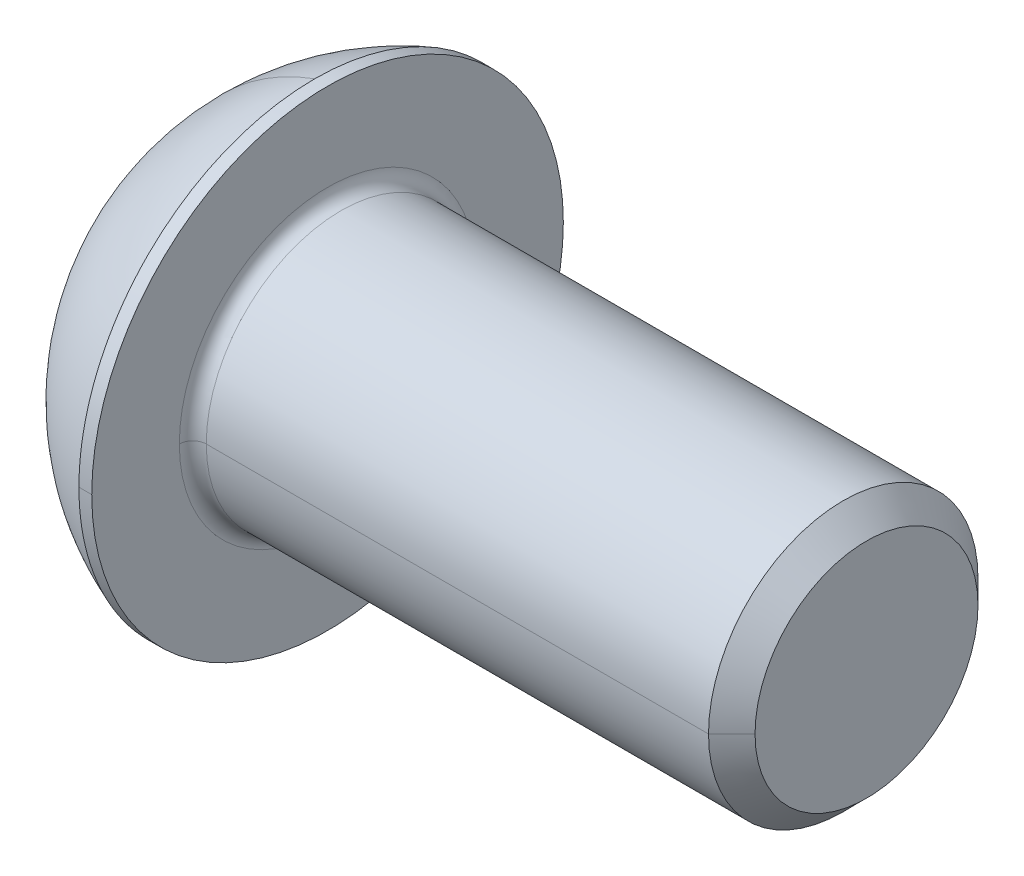
ISO-10303-21;
HEADER;
FILE_DESCRIPTION(('STEP AP214'),'2;1');
FILE_NAME('part.step','',(''),(''),'','','');
FILE_SCHEMA(('AUTOMOTIVE_DESIGN { 1 0 10303 214 1 1 1 1 }'));
ENDSEC;
DATA;
#1=APPLICATION_CONTEXT('core data for automotive mechanical design processes');
#2=APPLICATION_PROTOCOL_DEFINITION('international standard','automotive_design',2000,#1);
#3=PRODUCT_CONTEXT('',#1,'mechanical');
#4=PRODUCT('Part','Part','',(#3));
#5=PRODUCT_RELATED_PRODUCT_CATEGORY('part','',(#4));
#6=PRODUCT_DEFINITION_FORMATION('','',#4);
#7=PRODUCT_DEFINITION_CONTEXT('part definition',#1,'design');
#8=PRODUCT_DEFINITION('design','',#6,#7);
#9=PRODUCT_DEFINITION_SHAPE('','',#8);
#10=(LENGTH_UNIT() NAMED_UNIT(*) SI_UNIT(.MILLI.,.METRE.));
#11=(NAMED_UNIT(*) PLANE_ANGLE_UNIT() SI_UNIT($,.RADIAN.));
#12=(NAMED_UNIT(*) SI_UNIT($,.STERADIAN.) SOLID_ANGLE_UNIT());
#13=UNCERTAINTY_MEASURE_WITH_UNIT(LENGTH_MEASURE(1.E-05),#10,'distance_accuracy_value','');
#14=(GEOMETRIC_REPRESENTATION_CONTEXT(3) GLOBAL_UNCERTAINTY_ASSIGNED_CONTEXT((#13)) GLOBAL_UNIT_ASSIGNED_CONTEXT((#10,
#11,#12)) REPRESENTATION_CONTEXT('',''));
#15=CARTESIAN_POINT('',(0.,0.,0.));
#16=DIRECTION('',(0.,0.,1.));
#17=DIRECTION('',(1.,0.,0.));
#18=AXIS2_PLACEMENT_3D('',#15,#16,#17);
#19=CARTESIAN_POINT('',(-995.956624327026,0.,0.));
#20=DIRECTION('',(-1.,0.,0.));
#21=DIRECTION('',(0.,0.,1.));
#22=AXIS2_PLACEMENT_3D('',#19,#20,#21);
#23=CONICAL_SURFACE('',#22,1732.05080756885,1.0471975511966);
#24=DIRECTION('',(-0.5,0.,-0.866025403784436));
#25=VECTOR('',#24,1.);
#26=CARTESIAN_POINT('',(4.04337567297408,0.,0.));
#27=LINE('',#26,#25);
#28=CARTESIAN_POINT('',(4.04337567297408,0.,0.));
#29=VERTEX_POINT('',#28);
#30=CARTESIAN_POINT('',(2.6,0.,-2.5));
#31=VERTEX_POINT('',#30);
#32=EDGE_CURVE('E227',#29,#31,#27,.T.);
#33=ORIENTED_EDGE('',*,*,#32,.F.);
#34=DIRECTION('',(-0.5,0.,0.866025403784436));
#35=VECTOR('',#34,1.);
#36=CARTESIAN_POINT('',(4.04337567297408,0.,0.));
#37=LINE('',#36,#35);
#38=CARTESIAN_POINT('',(2.6,0.,2.5));
#39=VERTEX_POINT('',#38);
#40=EDGE_CURVE('E232',#29,#39,#37,.T.);
#41=ORIENTED_EDGE('',*,*,#40,.T.);
#42=CARTESIAN_POINT('',(2.6,0.,0.));
#43=DIRECTION('',(-1.,0.,0.));
#44=DIRECTION('',(0.,0.,1.));
#45=AXIS2_PLACEMENT_3D('',#42,#43,#44);
#46=CIRCLE('',#45,2.5);
#47=CARTESIAN_POINT('',(2.6,2.1650635094611,1.25));
#48=VERTEX_POINT('',#47);
#49=EDGE_CURVE('E11',#39,#48,#46,.T.);
#50=ORIENTED_EDGE('',*,*,#49,.T.);
#51=CARTESIAN_POINT('',(2.6,0.,0.));
#52=DIRECTION('',(-1.,0.,0.));
#53=DIRECTION('',(0.,0.,1.));
#54=AXIS2_PLACEMENT_3D('',#51,#52,#53);
#55=CIRCLE('',#54,2.5);
#56=CARTESIAN_POINT('',(2.6,2.1650635094611,-1.25));
#57=VERTEX_POINT('',#56);
#58=EDGE_CURVE('E27',#48,#57,#55,.T.);
#59=ORIENTED_EDGE('',*,*,#58,.T.);
#60=CARTESIAN_POINT('',(2.6,0.,0.));
#61=DIRECTION('',(-1.,0.,0.));
#62=DIRECTION('',(0.,0.,1.));
#63=AXIS2_PLACEMENT_3D('',#60,#61,#62);
#64=CIRCLE('',#63,2.5);
#65=EDGE_CURVE('E259',#57,#31,#64,.T.);
#66=ORIENTED_EDGE('',*,*,#65,.T.);
#67=EDGE_LOOP('',(#33,#41,#50,#59,#66));
#68=FACE_BOUND('',#67,.T.);
#69=ADVANCED_FACE('F16',(#68),#23,.F.);
#70=CARTESIAN_POINT('',(2.6,-2.88675134594813,0.));
#71=DIRECTION('',(1.,0.,0.));
#72=DIRECTION('',(0.,1.,0.));
#73=AXIS2_PLACEMENT_3D('',#70,#71,#72);
#74=PLANE('',#73);
#75=CARTESIAN_POINT('',(2.6,0.,0.));
#76=DIRECTION('',(-1.,0.,0.));
#77=DIRECTION('',(0.,0.,1.));
#78=AXIS2_PLACEMENT_3D('',#75,#76,#77);
#79=CIRCLE('',#78,2.5);
#80=CARTESIAN_POINT('',(2.6,-2.1650635094611,-1.25));
#81=VERTEX_POINT('',#80);
#82=EDGE_CURVE('E231',#31,#81,#79,.T.);
#83=ORIENTED_EDGE('',*,*,#82,.F.);
#84=DIRECTION('',(0.,1.,0.));
#85=VECTOR('',#84,1.);
#86=CARTESIAN_POINT('',(2.6,1.44337567297406,-2.5));
#87=LINE('',#86,#85);
#88=CARTESIAN_POINT('',(2.6,-1.44337567297406,-2.5));
#89=VERTEX_POINT('',#88);
#90=EDGE_CURVE('E381',#89,#31,#87,.T.);
#91=ORIENTED_EDGE('',*,*,#90,.F.);
#92=DIRECTION('',(0.,0.5,-0.866025403784439));
#93=VECTOR('',#92,1.);
#94=CARTESIAN_POINT('',(2.6,-1.44337567297406,-2.5));
#95=LINE('',#94,#93);
#96=EDGE_CURVE('E353',#81,#89,#95,.T.);
#97=ORIENTED_EDGE('',*,*,#96,.F.);
#98=EDGE_LOOP('',(#83,#91,#97));
#99=FACE_BOUND('',#98,.T.);
#100=ADVANCED_FACE('F462',(#99),#74,.F.);
#101=CARTESIAN_POINT('',(2.6,-2.88675134594813,0.));
#102=DIRECTION('',(1.,0.,0.));
#103=DIRECTION('',(0.,1.,0.));
#104=AXIS2_PLACEMENT_3D('',#101,#102,#103);
#105=PLANE('',#104);
#106=CARTESIAN_POINT('',(2.6,0.,0.));
#107=DIRECTION('',(-1.,0.,0.));
#108=DIRECTION('',(0.,0.,1.));
#109=AXIS2_PLACEMENT_3D('',#106,#107,#108);
#110=CIRCLE('',#109,2.5);
#111=CARTESIAN_POINT('',(2.6,-2.1650635094611,1.25));
#112=VERTEX_POINT('',#111);
#113=EDGE_CURVE('E239',#81,#112,#110,.T.);
#114=ORIENTED_EDGE('',*,*,#113,.F.);
#115=DIRECTION('',(0.,0.5,-0.866025403784439));
#116=VECTOR('',#115,1.);
#117=CARTESIAN_POINT('',(2.6,-1.44337567297406,-2.5));
#118=LINE('',#117,#116);
#119=CARTESIAN_POINT('',(2.6,-2.88675134594813,0.));
#120=VERTEX_POINT('',#119);
#121=EDGE_CURVE('E281',#120,#81,#118,.T.);
#122=ORIENTED_EDGE('',*,*,#121,.F.);
#123=DIRECTION('',(0.,-0.5,-0.866025403784439));
#124=VECTOR('',#123,1.);
#125=CARTESIAN_POINT('',(2.6,-2.88675134594813,0.));
#126=LINE('',#125,#124);
#127=EDGE_CURVE('E286',#112,#120,#126,.T.);
#128=ORIENTED_EDGE('',*,*,#127,.F.);
#129=EDGE_LOOP('',(#114,#122,#128));
#130=FACE_BOUND('',#129,.T.);
#131=ADVANCED_FACE('F468',(#130),#105,.F.);
#132=CARTESIAN_POINT('',(2.6,-2.88675134594813,0.));
#133=DIRECTION('',(1.,0.,0.));
#134=DIRECTION('',(0.,1.,0.));
#135=AXIS2_PLACEMENT_3D('',#132,#133,#134);
#136=PLANE('',#135);
#137=CARTESIAN_POINT('',(2.6,0.,0.));
#138=DIRECTION('',(-1.,0.,0.));
#139=DIRECTION('',(0.,0.,1.));
#140=AXIS2_PLACEMENT_3D('',#137,#138,#139);
#141=CIRCLE('',#140,2.5);
#142=EDGE_CURVE('E240',#112,#39,#141,.T.);
#143=ORIENTED_EDGE('',*,*,#142,.F.);
#144=DIRECTION('',(0.,-0.5,-0.866025403784439));
#145=VECTOR('',#144,1.);
#146=CARTESIAN_POINT('',(2.6,-2.88675134594813,0.));
#147=LINE('',#146,#145);
#148=CARTESIAN_POINT('',(2.6,-1.44337567297406,2.5));
#149=VERTEX_POINT('',#148);
#150=EDGE_CURVE('E202',#149,#112,#147,.T.);
#151=ORIENTED_EDGE('',*,*,#150,.F.);
#152=DIRECTION('',(0.,-1.,0.));
#153=VECTOR('',#152,1.);
#154=CARTESIAN_POINT('',(2.6,-1.44337567297406,2.5));
#155=LINE('',#154,#153);
#156=EDGE_CURVE('E276',#39,#149,#155,.T.);
#157=ORIENTED_EDGE('',*,*,#156,.F.);
#158=EDGE_LOOP('',(#143,#151,#157));
#159=FACE_BOUND('',#158,.T.);
#160=ADVANCED_FACE('F485',(#159),#136,.F.);
#161=CARTESIAN_POINT('',(2.6,-2.88675134594813,0.));
#162=DIRECTION('',(1.,0.,0.));
#163=DIRECTION('',(0.,1.,0.));
#164=AXIS2_PLACEMENT_3D('',#161,#162,#163);
#165=PLANE('',#164);
#166=ORIENTED_EDGE('',*,*,#49,.F.);
#167=DIRECTION('',(0.,-1.,0.));
#168=VECTOR('',#167,1.);
#169=CARTESIAN_POINT('',(2.6,-1.44337567297406,2.5));
#170=LINE('',#169,#168);
#171=CARTESIAN_POINT('',(2.6,1.44337567297406,2.5));
#172=VERTEX_POINT('',#171);
#173=EDGE_CURVE('E42',#172,#39,#170,.T.);
#174=ORIENTED_EDGE('',*,*,#173,.F.);
#175=DIRECTION('',(0.,-0.5,0.866025403784439));
#176=VECTOR('',#175,1.);
#177=CARTESIAN_POINT('',(2.6,1.44337567297406,2.5));
#178=LINE('',#177,#176);
#179=EDGE_CURVE('E298',#48,#172,#178,.T.);
#180=ORIENTED_EDGE('',*,*,#179,.F.);
#181=EDGE_LOOP('',(#166,#174,#180));
#182=FACE_BOUND('',#181,.T.);
#183=ADVANCED_FACE('F488',(#182),#165,.F.);
#184=CARTESIAN_POINT('',(2.6,-2.88675134594813,0.));
#185=DIRECTION('',(1.,0.,0.));
#186=DIRECTION('',(0.,1.,0.));
#187=AXIS2_PLACEMENT_3D('',#184,#185,#186);
#188=PLANE('',#187);
#189=ORIENTED_EDGE('',*,*,#58,.F.);
#190=DIRECTION('',(0.,-0.5,0.866025403784439));
#191=VECTOR('',#190,1.);
#192=CARTESIAN_POINT('',(2.6,1.44337567297406,2.5));
#193=LINE('',#192,#191);
#194=CARTESIAN_POINT('',(2.6,2.88675134594813,0.));
#195=VERTEX_POINT('',#194);
#196=EDGE_CURVE('E289',#195,#48,#193,.T.);
#197=ORIENTED_EDGE('',*,*,#196,.F.);
#198=DIRECTION('',(0.,0.5,0.866025403784439));
#199=VECTOR('',#198,1.);
#200=CARTESIAN_POINT('',(2.6,2.88675134594813,0.));
#201=LINE('',#200,#199);
#202=EDGE_CURVE('E245',#57,#195,#201,.T.);
#203=ORIENTED_EDGE('',*,*,#202,.F.);
#204=EDGE_LOOP('',(#189,#197,#203));
#205=FACE_BOUND('',#204,.T.);
#206=ADVANCED_FACE('F473',(#205),#188,.F.);
#207=CARTESIAN_POINT('',(2.6,-2.88675134594813,0.));
#208=DIRECTION('',(1.,0.,0.));
#209=DIRECTION('',(0.,1.,0.));
#210=AXIS2_PLACEMENT_3D('',#207,#208,#209);
#211=PLANE('',#210);
#212=ORIENTED_EDGE('',*,*,#65,.F.);
#213=DIRECTION('',(0.,0.5,0.866025403784439));
#214=VECTOR('',#213,1.);
#215=CARTESIAN_POINT('',(2.6,2.88675134594813,0.));
#216=LINE('',#215,#214);
#217=CARTESIAN_POINT('',(2.6,1.44337567297406,-2.5));
#218=VERTEX_POINT('',#217);
#219=EDGE_CURVE('E250',#218,#57,#216,.T.);
#220=ORIENTED_EDGE('',*,*,#219,.F.);
#221=DIRECTION('',(0.,1.,0.));
#222=VECTOR('',#221,1.);
#223=CARTESIAN_POINT('',(2.6,1.44337567297406,-2.5));
#224=LINE('',#223,#222);
#225=EDGE_CURVE('E293',#31,#218,#224,.T.);
#226=ORIENTED_EDGE('',*,*,#225,.F.);
#227=EDGE_LOOP('',(#212,#220,#226));
#228=FACE_BOUND('',#227,.T.);
#229=ADVANCED_FACE('F539',(#228),#211,.F.);
#230=CARTESIAN_POINT('',(2.6,-1.44337567297406,2.5));
#231=DIRECTION('',(0.,0.,-1.));
#232=DIRECTION('',(0.,-1.,0.));
#233=AXIS2_PLACEMENT_3D('',#230,#231,#232);
#234=PLANE('',#233);
#235=ORIENTED_EDGE('',*,*,#173,.T.);
#236=ORIENTED_EDGE('',*,*,#156,.T.);
#237=DIRECTION('',(-1.,0.,0.));
#238=VECTOR('',#237,1.);
#239=CARTESIAN_POINT('',(2.6,-1.44337567297406,2.5));
#240=LINE('',#239,#238);
#241=CARTESIAN_POINT('',(0.,-1.44337567297406,2.5));
#242=VERTEX_POINT('',#241);
#243=EDGE_CURVE('E278',#149,#242,#240,.T.);
#244=ORIENTED_EDGE('',*,*,#243,.T.);
#245=DIRECTION('',(0.,-1.,0.));
#246=VECTOR('',#245,1.);
#247=CARTESIAN_POINT('',(0.,-1.44337567297406,2.5));
#248=LINE('',#247,#246);
#249=CARTESIAN_POINT('',(0.,1.44337567297406,2.5));
#250=VERTEX_POINT('',#249);
#251=EDGE_CURVE('E368',#250,#242,#248,.T.);
#252=ORIENTED_EDGE('',*,*,#251,.F.);
#253=DIRECTION('',(-1.,0.,0.));
#254=VECTOR('',#253,1.);
#255=CARTESIAN_POINT('',(2.6,1.44337567297406,2.5));
#256=LINE('',#255,#254);
#257=EDGE_CURVE('E277',#172,#250,#256,.T.);
#258=ORIENTED_EDGE('',*,*,#257,.F.);
#259=EDGE_LOOP('',(#235,#236,#244,#252,#258));
#260=FACE_BOUND('',#259,.T.);
#261=ADVANCED_FACE('F523',(#260),#234,.T.);
#262=CARTESIAN_POINT('',(2.6,1.44337567297406,2.5));
#263=DIRECTION('',(0.,-0.866025403784439,-0.5));
#264=DIRECTION('',(0.,0.5,-0.866025403784439));
#265=AXIS2_PLACEMENT_3D('',#262,#263,#264);
#266=PLANE('',#265);
#267=ORIENTED_EDGE('',*,*,#196,.T.);
#268=ORIENTED_EDGE('',*,*,#179,.T.);
#269=ORIENTED_EDGE('',*,*,#257,.T.);
#270=DIRECTION('',(0.,-0.5,0.866025403784439));
#271=VECTOR('',#270,1.);
#272=CARTESIAN_POINT('',(0.,1.44337567297406,2.5));
#273=LINE('',#272,#271);
#274=CARTESIAN_POINT('',(0.,2.88675134594813,0.));
#275=VERTEX_POINT('',#274);
#276=EDGE_CURVE('E344',#275,#250,#273,.T.);
#277=ORIENTED_EDGE('',*,*,#276,.F.);
#278=DIRECTION('',(-1.,0.,0.));
#279=VECTOR('',#278,1.);
#280=CARTESIAN_POINT('',(2.6,2.88675134594813,0.));
#281=LINE('',#280,#279);
#282=EDGE_CURVE('E249',#195,#275,#281,.T.);
#283=ORIENTED_EDGE('',*,*,#282,.F.);
#284=EDGE_LOOP('',(#267,#268,#269,#277,#283));
#285=FACE_BOUND('',#284,.T.);
#286=ADVANCED_FACE('F481',(#285),#266,.T.);
#287=CARTESIAN_POINT('',(2.6,2.88675134594813,0.));
#288=DIRECTION('',(0.,-0.866025403784439,0.5));
#289=DIRECTION('',(-1.,0.,0.));
#290=AXIS2_PLACEMENT_3D('',#287,#288,#289);
#291=PLANE('',#290);
#292=ORIENTED_EDGE('',*,*,#219,.T.);
#293=ORIENTED_EDGE('',*,*,#202,.T.);
#294=ORIENTED_EDGE('',*,*,#282,.T.);
#295=DIRECTION('',(0.,0.5,0.866025403784439));
#296=VECTOR('',#295,1.);
#297=CARTESIAN_POINT('',(0.,2.88675134594813,0.));
#298=LINE('',#297,#296);
#299=CARTESIAN_POINT('',(0.,1.44337567297406,-2.5));
#300=VERTEX_POINT('',#299);
#301=EDGE_CURVE('E20',#300,#275,#298,.T.);
#302=ORIENTED_EDGE('',*,*,#301,.F.);
#303=DIRECTION('',(-1.,0.,0.));
#304=VECTOR('',#303,1.);
#305=CARTESIAN_POINT('',(2.6,1.44337567297406,-2.5));
#306=LINE('',#305,#304);
#307=EDGE_CURVE('E290',#218,#300,#306,.T.);
#308=ORIENTED_EDGE('',*,*,#307,.F.);
#309=EDGE_LOOP('',(#292,#293,#294,#302,#308));
#310=FACE_BOUND('',#309,.T.);
#311=ADVANCED_FACE('F477',(#310),#291,.T.);
#312=CARTESIAN_POINT('',(2.6,1.44337567297406,-2.5));
#313=DIRECTION('',(0.,0.,1.));
#314=DIRECTION('',(1.,0.,0.));
#315=AXIS2_PLACEMENT_3D('',#312,#313,#314);
#316=PLANE('',#315);
#317=ORIENTED_EDGE('',*,*,#90,.T.);
#318=ORIENTED_EDGE('',*,*,#225,.T.);
#319=ORIENTED_EDGE('',*,*,#307,.T.);
#320=DIRECTION('',(0.,1.,0.));
#321=VECTOR('',#320,1.);
#322=CARTESIAN_POINT('',(0.,1.44337567297406,-2.5));
#323=LINE('',#322,#321);
#324=CARTESIAN_POINT('',(0.,-1.44337567297406,-2.5));
#325=VERTEX_POINT('',#324);
#326=EDGE_CURVE('E269',#325,#300,#323,.T.);
#327=ORIENTED_EDGE('',*,*,#326,.F.);
#328=DIRECTION('',(-1.,0.,0.));
#329=VECTOR('',#328,1.);
#330=CARTESIAN_POINT('',(2.6,-1.44337567297406,-2.5));
#331=LINE('',#330,#329);
#332=EDGE_CURVE('E357',#89,#325,#331,.T.);
#333=ORIENTED_EDGE('',*,*,#332,.F.);
#334=EDGE_LOOP('',(#317,#318,#319,#327,#333));
#335=FACE_BOUND('',#334,.T.);
#336=ADVANCED_FACE('F480',(#335),#316,.T.);
#337=CARTESIAN_POINT('',(2.6,-1.44337567297406,-2.5));
#338=DIRECTION('',(0.,0.866025403784439,0.5));
#339=DIRECTION('',(1.,0.,0.));
#340=AXIS2_PLACEMENT_3D('',#337,#338,#339);
#341=PLANE('',#340);
#342=ORIENTED_EDGE('',*,*,#121,.T.);
#343=ORIENTED_EDGE('',*,*,#96,.T.);
#344=ORIENTED_EDGE('',*,*,#332,.T.);
#345=DIRECTION('',(0.,0.5,-0.866025403784439));
#346=VECTOR('',#345,1.);
#347=CARTESIAN_POINT('',(0.,-1.44337567297406,-2.5));
#348=LINE('',#347,#346);
#349=CARTESIAN_POINT('',(0.,-2.88675134594813,0.));
#350=VERTEX_POINT('',#349);
#351=EDGE_CURVE('E273',#350,#325,#348,.T.);
#352=ORIENTED_EDGE('',*,*,#351,.F.);
#353=DIRECTION('',(-1.,0.,0.));
#354=VECTOR('',#353,1.);
#355=CARTESIAN_POINT('',(2.6,-2.88675134594813,0.));
#356=LINE('',#355,#354);
#357=EDGE_CURVE('E282',#120,#350,#356,.T.);
#358=ORIENTED_EDGE('',*,*,#357,.F.);
#359=EDGE_LOOP('',(#342,#343,#344,#352,#358));
#360=FACE_BOUND('',#359,.T.);
#361=ADVANCED_FACE('F513',(#360),#341,.T.);
#362=CARTESIAN_POINT('',(2.6,-2.88675134594813,0.));
#363=DIRECTION('',(0.,0.866025403784439,-0.5));
#364=DIRECTION('',(-1.,0.,0.));
#365=AXIS2_PLACEMENT_3D('',#362,#363,#364);
#366=PLANE('',#365);
#367=ORIENTED_EDGE('',*,*,#150,.T.);
#368=ORIENTED_EDGE('',*,*,#127,.T.);
#369=ORIENTED_EDGE('',*,*,#357,.T.);
#370=DIRECTION('',(0.,-0.5,-0.866025403784439));
#371=VECTOR('',#370,1.);
#372=CARTESIAN_POINT('',(0.,-2.88675134594813,0.));
#373=LINE('',#372,#371);
#374=EDGE_CURVE('E297',#242,#350,#373,.T.);
#375=ORIENTED_EDGE('',*,*,#374,.F.);
#376=ORIENTED_EDGE('',*,*,#243,.F.);
#377=EDGE_LOOP('',(#367,#368,#369,#375,#376));
#378=FACE_BOUND('',#377,.T.);
#379=ADVANCED_FACE('F509',(#378),#366,.T.);
#380=CARTESIAN_POINT('',(4.8,0.,0.));
#381=DIRECTION('',(-1.,0.,0.));
#382=DIRECTION('',(0.,0.,1.));
#383=AXIS2_PLACEMENT_3D('',#380,#381,#382);
#384=TOROIDAL_SURFACE('',#383,4.4,0.4);
#385=CARTESIAN_POINT('',(4.8,0.,-4.4));
#386=DIRECTION('',(0.,1.,0.));
#387=DIRECTION('',(0.,0.,1.));
#388=AXIS2_PLACEMENT_3D('',#385,#386,#387);
#389=CIRCLE('',#388,0.4);
#390=CARTESIAN_POINT('',(4.4,0.,-4.4));
#391=VERTEX_POINT('',#390);
#392=CARTESIAN_POINT('',(4.8,0.,-4.));
#393=VERTEX_POINT('',#392);
#394=EDGE_CURVE('E235',#391,#393,#389,.T.);
#395=ORIENTED_EDGE('',*,*,#394,.F.);
#396=CARTESIAN_POINT('',(4.4,0.,0.));
#397=DIRECTION('',(-1.,0.,0.));
#398=DIRECTION('',(0.,0.,1.));
#399=AXIS2_PLACEMENT_3D('',#396,#397,#398);
#400=CIRCLE('',#399,4.4);
#401=CARTESIAN_POINT('',(4.4,0.,4.4));
#402=VERTEX_POINT('',#401);
#403=EDGE_CURVE('E332',#402,#391,#400,.T.);
#404=ORIENTED_EDGE('',*,*,#403,.F.);
#405=CARTESIAN_POINT('',(4.8,0.,4.4));
#406=DIRECTION('',(0.,-1.,0.));
#407=DIRECTION('',(0.,0.,-1.));
#408=AXIS2_PLACEMENT_3D('',#405,#406,#407);
#409=CIRCLE('',#408,0.4);
#410=CARTESIAN_POINT('',(4.8,0.,4.));
#411=VERTEX_POINT('',#410);
#412=EDGE_CURVE('E217',#402,#411,#409,.T.);
#413=ORIENTED_EDGE('',*,*,#412,.T.);
#414=CARTESIAN_POINT('',(4.8,0.,0.));
#415=DIRECTION('',(1.,0.,0.));
#416=DIRECTION('',(0.,0.,1.));
#417=AXIS2_PLACEMENT_3D('',#414,#415,#416);
#418=CIRCLE('',#417,4.);
#419=EDGE_CURVE('E104',#393,#411,#418,.T.);
#420=ORIENTED_EDGE('',*,*,#419,.F.);
#421=EDGE_LOOP('',(#395,#404,#413,#420));
#422=FACE_BOUND('',#421,.T.);
#423=ADVANCED_FACE('F18',(#422),#384,.F.);
#424=CARTESIAN_POINT('',(20.4,0.,0.));
#425=DIRECTION('',(-1.,0.,0.));
#426=DIRECTION('',(0.,0.,1.));
#427=AXIS2_PLACEMENT_3D('',#424,#425,#426);
#428=PLANE('',#427);
#429=CARTESIAN_POINT('',(20.4,0.,0.));
#430=DIRECTION('',(-1.,0.,0.));
#431=DIRECTION('',(0.,0.,1.));
#432=AXIS2_PLACEMENT_3D('',#429,#430,#431);
#433=CIRCLE('',#432,3.3095);
#434=CARTESIAN_POINT('',(20.4,0.,3.3095));
#435=VERTEX_POINT('',#434);
#436=CARTESIAN_POINT('',(20.4,0.,-3.3095));
#437=VERTEX_POINT('',#436);
#438=EDGE_CURVE('E197',#435,#437,#433,.T.);
#439=ORIENTED_EDGE('',*,*,#438,.F.);
#440=CARTESIAN_POINT('',(20.4,0.,0.));
#441=DIRECTION('',(-1.,0.,0.));
#442=DIRECTION('',(0.,0.,1.));
#443=AXIS2_PLACEMENT_3D('',#440,#441,#442);
#444=CIRCLE('',#443,3.3095);
#445=EDGE_CURVE('E193',#437,#435,#444,.T.);
#446=ORIENTED_EDGE('',*,*,#445,.F.);
#447=EDGE_LOOP('',(#439,#446));
#448=FACE_BOUND('',#447,.T.);
#449=ADVANCED_FACE('F195',(#448),#428,.F.);
#450=CARTESIAN_POINT('',(20.4,0.,0.));
#451=DIRECTION('',(-1.,0.,0.));
#452=DIRECTION('',(0.,0.,1.));
#453=AXIS2_PLACEMENT_3D('',#450,#451,#452);
#454=CONICAL_SURFACE('',#453,3.3095,0.785398163397446);
#455=DIRECTION('',(-0.707106781186549,0.,-0.707106781186546));
#456=VECTOR('',#455,1.);
#457=CARTESIAN_POINT('',(20.4,0.,-3.3095));
#458=LINE('',#457,#456);
#459=CARTESIAN_POINT('',(19.7095,0.,-4.));
#460=VERTEX_POINT('',#459);
#461=EDGE_CURVE('E206',#437,#460,#458,.T.);
#462=ORIENTED_EDGE('',*,*,#461,.F.);
#463=ORIENTED_EDGE('',*,*,#445,.T.);
#464=DIRECTION('',(-0.707106781186549,0.,0.707106781186546));
#465=VECTOR('',#464,1.);
#466=CARTESIAN_POINT('',(20.4,0.,3.3095));
#467=LINE('',#466,#465);
#468=CARTESIAN_POINT('',(19.7095,0.,4.));
#469=VERTEX_POINT('',#468);
#470=EDGE_CURVE('E215',#435,#469,#467,.T.);
#471=ORIENTED_EDGE('',*,*,#470,.T.);
#472=CARTESIAN_POINT('',(19.7095,0.,0.));
#473=DIRECTION('',(-1.,0.,0.));
#474=DIRECTION('',(0.,0.,1.));
#475=AXIS2_PLACEMENT_3D('',#472,#473,#474);
#476=CIRCLE('',#475,4.);
#477=EDGE_CURVE('E203',#460,#469,#476,.T.);
#478=ORIENTED_EDGE('',*,*,#477,.F.);
#479=EDGE_LOOP('',(#462,#463,#471,#478));
#480=FACE_BOUND('',#479,.T.);
#481=ADVANCED_FACE('F207',(#480),#454,.T.);
#482=CARTESIAN_POINT('',(0.,0.,0.));
#483=DIRECTION('',(-1.,0.,0.));
#484=DIRECTION('',(0.,0.,1.));
#485=AXIS2_PLACEMENT_3D('',#482,#483,#484);
#486=CYLINDRICAL_SURFACE('',#485,4.);
#487=DIRECTION('',(-1.,0.,0.));
#488=VECTOR('',#487,1.);
#489=CARTESIAN_POINT('',(0.,0.,-4.));
#490=LINE('',#489,#488);
#491=EDGE_CURVE('E253',#460,#393,#490,.T.);
#492=ORIENTED_EDGE('',*,*,#491,.F.);
#493=ORIENTED_EDGE('',*,*,#477,.T.);
#494=DIRECTION('',(-1.,0.,0.));
#495=VECTOR('',#494,1.);
#496=CARTESIAN_POINT('',(0.,0.,4.));
#497=LINE('',#496,#495);
#498=EDGE_CURVE('E87',#469,#411,#497,.T.);
#499=ORIENTED_EDGE('',*,*,#498,.T.);
#500=CARTESIAN_POINT('',(4.8,0.,0.));
#501=DIRECTION('',(1.,0.,0.));
#502=DIRECTION('',(0.,0.,1.));
#503=AXIS2_PLACEMENT_3D('',#500,#501,#502);
#504=CIRCLE('',#503,4.);
#505=EDGE_CURVE('E223',#411,#393,#504,.T.);
#506=ORIENTED_EDGE('',*,*,#505,.T.);
#507=EDGE_LOOP('',(#492,#493,#499,#506));
#508=FACE_BOUND('',#507,.T.);
#509=ADVANCED_FACE('F418',(#508),#486,.T.);
#510=CARTESIAN_POINT('',(4.4,4.,0.));
#511=DIRECTION('',(-1.,0.,0.));
#512=DIRECTION('',(0.,0.,1.));
#513=AXIS2_PLACEMENT_3D('',#510,#511,#512);
#514=PLANE('',#513);
#515=ORIENTED_EDGE('',*,*,#403,.T.);
#516=CARTESIAN_POINT('',(4.4,0.,0.));
#517=DIRECTION('',(-1.,0.,0.));
#518=DIRECTION('',(0.,0.,1.));
#519=AXIS2_PLACEMENT_3D('',#516,#517,#518);
#520=CIRCLE('',#519,4.4);
#521=EDGE_CURVE('E244',#391,#402,#520,.T.);
#522=ORIENTED_EDGE('',*,*,#521,.T.);
#523=EDGE_LOOP('',(#515,#522));
#524=FACE_BOUND('',#523,.T.);
#525=CARTESIAN_POINT('',(4.4,0.,0.));
#526=DIRECTION('',(-1.,0.,0.));
#527=DIRECTION('',(0.,0.,1.));
#528=AXIS2_PLACEMENT_3D('',#525,#526,#527);
#529=CIRCLE('',#528,7.);
#530=CARTESIAN_POINT('',(4.4,0.,7.));
#531=VERTEX_POINT('',#530);
#532=CARTESIAN_POINT('',(4.4,0.,-7.));
#533=VERTEX_POINT('',#532);
#534=EDGE_CURVE('E265',#531,#533,#529,.T.);
#535=ORIENTED_EDGE('',*,*,#534,.F.);
#536=CARTESIAN_POINT('',(4.4,0.,0.));
#537=DIRECTION('',(-1.,0.,0.));
#538=DIRECTION('',(0.,0.,1.));
#539=AXIS2_PLACEMENT_3D('',#536,#537,#538);
#540=CIRCLE('',#539,7.);
#541=EDGE_CURVE('E329',#533,#531,#540,.T.);
#542=ORIENTED_EDGE('',*,*,#541,.F.);
#543=EDGE_LOOP('',(#535,#542));
#544=FACE_BOUND('',#543,.T.);
#545=ADVANCED_FACE('F430',(#524,#544),#514,.F.);
#546=CARTESIAN_POINT('',(0.,0.,0.));
#547=DIRECTION('',(-1.,0.,0.));
#548=DIRECTION('',(0.,0.,1.));
#549=AXIS2_PLACEMENT_3D('',#546,#547,#548);
#550=CYLINDRICAL_SURFACE('',#549,7.);
#551=DIRECTION('',(-1.,0.,0.));
#552=VECTOR('',#551,1.);
#553=CARTESIAN_POINT('',(0.,0.,-7.));
#554=LINE('',#553,#552);
#555=CARTESIAN_POINT('',(4.02,0.,-7.));
#556=VERTEX_POINT('',#555);
#557=EDGE_CURVE('E317',#533,#556,#554,.T.);
#558=ORIENTED_EDGE('',*,*,#557,.F.);
#559=ORIENTED_EDGE('',*,*,#541,.T.);
#560=DIRECTION('',(-1.,0.,0.));
#561=VECTOR('',#560,1.);
#562=CARTESIAN_POINT('',(0.,0.,7.));
#563=LINE('',#562,#561);
#564=CARTESIAN_POINT('',(4.02,0.,7.));
#565=VERTEX_POINT('',#564);
#566=EDGE_CURVE('E305',#531,#565,#563,.T.);
#567=ORIENTED_EDGE('',*,*,#566,.T.);
#568=CARTESIAN_POINT('',(4.02,0.,0.));
#569=DIRECTION('',(-1.,0.,0.));
#570=DIRECTION('',(0.,0.,1.));
#571=AXIS2_PLACEMENT_3D('',#568,#569,#570);
#572=CIRCLE('',#571,7.);
#573=CARTESIAN_POINT('',(4.02,-7.,0.));
#574=VERTEX_POINT('',#573);
#575=EDGE_CURVE('E333',#574,#565,#572,.T.);
#576=ORIENTED_EDGE('',*,*,#575,.F.);
#577=CARTESIAN_POINT('',(4.02,0.,0.));
#578=DIRECTION('',(-1.,0.,0.));
#579=DIRECTION('',(0.,0.,1.));
#580=AXIS2_PLACEMENT_3D('',#577,#578,#579);
#581=CIRCLE('',#580,7.);
#582=EDGE_CURVE('E314',#556,#574,#581,.T.);
#583=ORIENTED_EDGE('',*,*,#582,.F.);
#584=EDGE_LOOP('',(#558,#559,#567,#576,#583));
#585=FACE_BOUND('',#584,.T.);
#586=ADVANCED_FACE('F433',(#585),#550,.T.);
#587=CARTESIAN_POINT('',(6.58089552238806,0.,0.));
#588=DIRECTION('',(0.,0.,-1.));
#589=DIRECTION('',(0.,1.,0.));
#590=AXIS2_PLACEMENT_3D('',#587,#588,#589);
#591=SPHERICAL_SURFACE('',#590,7.45373637020973);
#592=CARTESIAN_POINT('',(6.58089552238806,0.,0.));
#593=DIRECTION('',(0.,0.,-1.));
#594=DIRECTION('',(0.,1.,0.));
#595=AXIS2_PLACEMENT_3D('',#592,#593,#594);
#596=CIRCLE('',#595,7.45373637020973);
#597=CARTESIAN_POINT('',(0.,-3.5,0.));
#598=VERTEX_POINT('',#597);
#599=EDGE_CURVE('E336',#574,#598,#596,.T.);
#600=ORIENTED_EDGE('',*,*,#599,.F.);
#601=ORIENTED_EDGE('',*,*,#575,.T.);
#602=CARTESIAN_POINT('',(4.02,0.,0.));
#603=DIRECTION('',(-1.,0.,0.));
#604=DIRECTION('',(0.,0.,1.));
#605=AXIS2_PLACEMENT_3D('',#602,#603,#604);
#606=CIRCLE('',#605,7.);
#607=CARTESIAN_POINT('',(4.02,7.,0.));
#608=VERTEX_POINT('',#607);
#609=EDGE_CURVE('E302',#565,#608,#606,.T.);
#610=ORIENTED_EDGE('',*,*,#609,.T.);
#611=CARTESIAN_POINT('',(6.58089552238806,0.,0.));
#612=DIRECTION('',(0.,0.,1.));
#613=DIRECTION('',(1.,0.,0.));
#614=AXIS2_PLACEMENT_3D('',#611,#612,#613);
#615=CIRCLE('',#614,7.45373637020972);
#616=CARTESIAN_POINT('',(0.,3.5,0.));
#617=VERTEX_POINT('',#616);
#618=EDGE_CURVE('E378',#608,#617,#615,.T.);
#619=ORIENTED_EDGE('',*,*,#618,.T.);
#620=CARTESIAN_POINT('',(0.,0.,0.));
#621=DIRECTION('',(-1.,0.,0.));
#622=DIRECTION('',(0.,0.,1.));
#623=AXIS2_PLACEMENT_3D('',#620,#621,#622);
#624=CIRCLE('',#623,3.5);
#625=EDGE_CURVE('E160',#598,#617,#624,.T.);
#626=ORIENTED_EDGE('',*,*,#625,.F.);
#627=EDGE_LOOP('',(#600,#601,#610,#619,#626));
#628=FACE_BOUND('',#627,.T.);
#629=ADVANCED_FACE('F448',(#628),#591,.T.);
#630=CARTESIAN_POINT('',(0.,0.,0.));
#631=DIRECTION('',(-1.,0.,0.));
#632=DIRECTION('',(0.,0.,1.));
#633=AXIS2_PLACEMENT_3D('',#630,#631,#632);
#634=PLANE('',#633);
#635=ORIENTED_EDGE('',*,*,#251,.T.);
#636=ORIENTED_EDGE('',*,*,#374,.T.);
#637=ORIENTED_EDGE('',*,*,#351,.T.);
#638=ORIENTED_EDGE('',*,*,#326,.T.);
#639=ORIENTED_EDGE('',*,*,#301,.T.);
#640=ORIENTED_EDGE('',*,*,#276,.T.);
#641=EDGE_LOOP('',(#635,#636,#637,#638,#639,#640));
#642=FACE_BOUND('',#641,.T.);
#643=CARTESIAN_POINT('',(0.,0.,0.));
#644=DIRECTION('',(-1.,0.,0.));
#645=DIRECTION('',(0.,0.,1.));
#646=AXIS2_PLACEMENT_3D('',#643,#644,#645);
#647=CIRCLE('',#646,3.5);
#648=EDGE_CURVE('E375',#617,#598,#647,.T.);
#649=ORIENTED_EDGE('',*,*,#648,.T.);
#650=ORIENTED_EDGE('',*,*,#625,.T.);
#651=EDGE_LOOP('',(#649,#650));
#652=FACE_BOUND('',#651,.T.);
#653=ADVANCED_FACE('F450',(#642,#652),#634,.T.);
#654=CARTESIAN_POINT('',(6.58089552238806,0.,0.));
#655=DIRECTION('',(0.,0.,-1.));
#656=DIRECTION('',(0.,1.,0.));
#657=AXIS2_PLACEMENT_3D('',#654,#655,#656);
#658=SPHERICAL_SURFACE('',#657,7.45373637020973);
#659=CARTESIAN_POINT('',(4.02,0.,0.));
#660=DIRECTION('',(-1.,0.,0.));
#661=DIRECTION('',(0.,0.,1.));
#662=AXIS2_PLACEMENT_3D('',#659,#660,#661);
#663=CIRCLE('',#662,7.);
#664=EDGE_CURVE('E306',#608,#556,#663,.T.);
#665=ORIENTED_EDGE('',*,*,#664,.T.);
#666=ORIENTED_EDGE('',*,*,#582,.T.);
#667=ORIENTED_EDGE('',*,*,#599,.T.);
#668=ORIENTED_EDGE('',*,*,#648,.F.);
#669=ORIENTED_EDGE('',*,*,#618,.F.);
#670=EDGE_LOOP('',(#665,#666,#667,#668,#669));
#671=FACE_BOUND('',#670,.T.);
#672=ADVANCED_FACE('F447',(#671),#658,.T.);
#673=CARTESIAN_POINT('',(0.,0.,0.));
#674=DIRECTION('',(-1.,0.,0.));
#675=DIRECTION('',(0.,0.,1.));
#676=AXIS2_PLACEMENT_3D('',#673,#674,#675);
#677=CYLINDRICAL_SURFACE('',#676,7.);
#678=ORIENTED_EDGE('',*,*,#534,.T.);
#679=ORIENTED_EDGE('',*,*,#557,.T.);
#680=ORIENTED_EDGE('',*,*,#664,.F.);
#681=ORIENTED_EDGE('',*,*,#609,.F.);
#682=ORIENTED_EDGE('',*,*,#566,.F.);
#683=EDGE_LOOP('',(#678,#679,#680,#681,#682));
#684=FACE_BOUND('',#683,.T.);
#685=ADVANCED_FACE('F440',(#684),#677,.T.);
#686=CARTESIAN_POINT('',(0.,0.,0.));
#687=DIRECTION('',(-1.,0.,0.));
#688=DIRECTION('',(0.,0.,1.));
#689=AXIS2_PLACEMENT_3D('',#686,#687,#688);
#690=CYLINDRICAL_SURFACE('',#689,4.);
#691=CARTESIAN_POINT('',(19.7095,0.,0.));
#692=DIRECTION('',(-1.,0.,0.));
#693=DIRECTION('',(0.,0.,1.));
#694=AXIS2_PLACEMENT_3D('',#691,#692,#693);
#695=CIRCLE('',#694,4.);
#696=EDGE_CURVE('E212',#469,#460,#695,.T.);
#697=ORIENTED_EDGE('',*,*,#696,.T.);
#698=ORIENTED_EDGE('',*,*,#491,.T.);
#699=ORIENTED_EDGE('',*,*,#419,.T.);
#700=ORIENTED_EDGE('',*,*,#498,.F.);
#701=EDGE_LOOP('',(#697,#698,#699,#700));
#702=FACE_BOUND('',#701,.T.);
#703=ADVANCED_FACE('F420',(#702),#690,.T.);
#704=CARTESIAN_POINT('',(20.4,0.,0.));
#705=DIRECTION('',(-1.,0.,0.));
#706=DIRECTION('',(0.,0.,1.));
#707=AXIS2_PLACEMENT_3D('',#704,#705,#706);
#708=CONICAL_SURFACE('',#707,3.3095,0.785398163397446);
#709=ORIENTED_EDGE('',*,*,#438,.T.);
#710=ORIENTED_EDGE('',*,*,#461,.T.);
#711=ORIENTED_EDGE('',*,*,#696,.F.);
#712=ORIENTED_EDGE('',*,*,#470,.F.);
#713=EDGE_LOOP('',(#709,#710,#711,#712));
#714=FACE_BOUND('',#713,.T.);
#715=ADVANCED_FACE('F214',(#714),#708,.T.);
#716=CARTESIAN_POINT('',(4.8,0.,0.));
#717=DIRECTION('',(-1.,0.,0.));
#718=DIRECTION('',(0.,0.,1.));
#719=AXIS2_PLACEMENT_3D('',#716,#717,#718);
#720=TOROIDAL_SURFACE('',#719,4.4,0.4);
#721=ORIENTED_EDGE('',*,*,#521,.F.);
#722=ORIENTED_EDGE('',*,*,#394,.T.);
#723=ORIENTED_EDGE('',*,*,#505,.F.);
#724=ORIENTED_EDGE('',*,*,#412,.F.);
#725=EDGE_LOOP('',(#721,#722,#723,#724));
#726=FACE_BOUND('',#725,.T.);
#727=ADVANCED_FACE('F425',(#726),#720,.F.);
#728=CARTESIAN_POINT('',(-995.956624327026,0.,0.));
#729=DIRECTION('',(-1.,0.,0.));
#730=DIRECTION('',(0.,0.,1.));
#731=AXIS2_PLACEMENT_3D('',#728,#729,#730);
#732=CONICAL_SURFACE('',#731,1732.05080756885,1.0471975511966);
#733=ORIENTED_EDGE('',*,*,#40,.F.);
#734=ORIENTED_EDGE('',*,*,#32,.T.);
#735=ORIENTED_EDGE('',*,*,#82,.T.);
#736=ORIENTED_EDGE('',*,*,#113,.T.);
#737=ORIENTED_EDGE('',*,*,#142,.T.);
#738=EDGE_LOOP('',(#733,#734,#735,#736,#737));
#739=FACE_BOUND('',#738,.T.);
#740=ADVANCED_FACE('F492',(#739),#732,.F.);
#741=CLOSED_SHELL('',(#69,#100,#131,#160,#183,#206,#229,#261,#286,#311,#336,#361,#379,#423,#449,
#481,#509,#545,#586,#629,#653,#672,#685,#703,#715,#727,#740));
#742=MANIFOLD_SOLID_BREP('B1',#741);
#743=ADVANCED_BREP_SHAPE_REPRESENTATION('',(#18,#742),#14);
#744=SHAPE_DEFINITION_REPRESENTATION(#9,#743);
ENDSEC;
END-ISO-10303-21;
